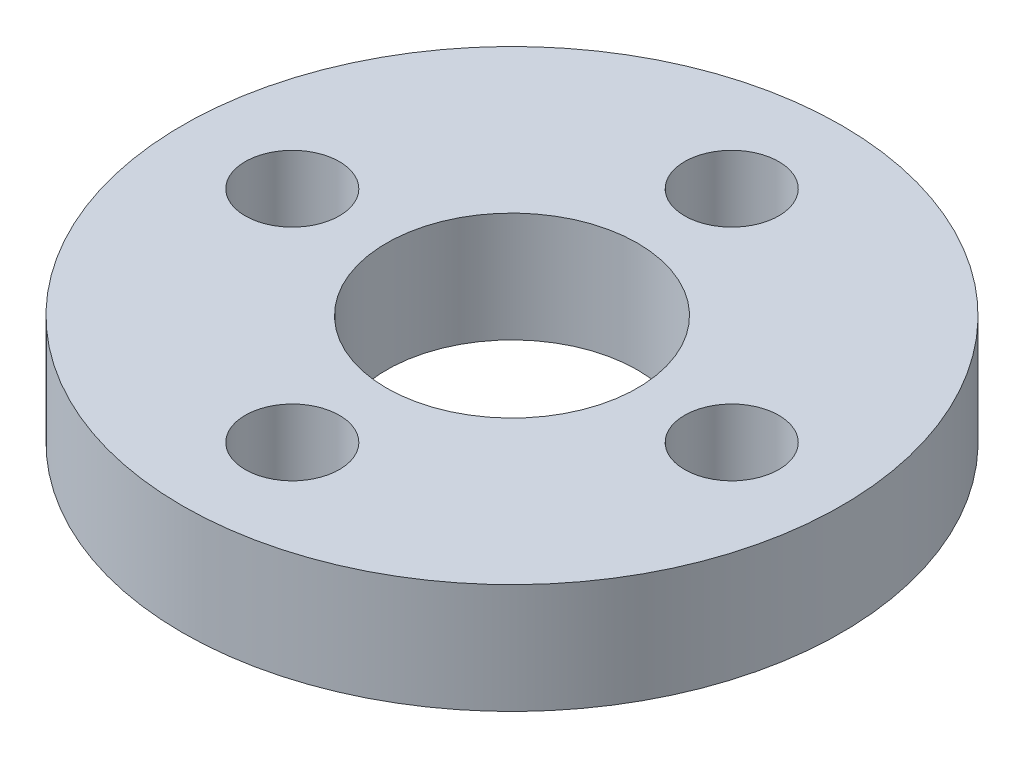
ISO-10303-21;
HEADER;
FILE_DESCRIPTION(('STEP AP214'),'2;1');
FILE_NAME('part.step','',(''),(''),'','','');
FILE_SCHEMA(('AUTOMOTIVE_DESIGN { 1 0 10303 214 1 1 1 1 }'));
ENDSEC;
DATA;
#1=APPLICATION_CONTEXT('core data for automotive mechanical design processes');
#2=APPLICATION_PROTOCOL_DEFINITION('international standard','automotive_design',2000,#1);
#3=PRODUCT_CONTEXT('',#1,'mechanical');
#4=PRODUCT('Part','Part','',(#3));
#5=PRODUCT_RELATED_PRODUCT_CATEGORY('part','',(#4));
#6=PRODUCT_DEFINITION_FORMATION('','',#4);
#7=PRODUCT_DEFINITION_CONTEXT('part definition',#1,'design');
#8=PRODUCT_DEFINITION('design','',#6,#7);
#9=PRODUCT_DEFINITION_SHAPE('','',#8);
#10=(LENGTH_UNIT() NAMED_UNIT(*) SI_UNIT(.MILLI.,.METRE.));
#11=(NAMED_UNIT(*) PLANE_ANGLE_UNIT() SI_UNIT($,.RADIAN.));
#12=(NAMED_UNIT(*) SI_UNIT($,.STERADIAN.) SOLID_ANGLE_UNIT());
#13=UNCERTAINTY_MEASURE_WITH_UNIT(LENGTH_MEASURE(1.E-05),#10,'distance_accuracy_value','');
#14=(GEOMETRIC_REPRESENTATION_CONTEXT(3) GLOBAL_UNCERTAINTY_ASSIGNED_CONTEXT((#13)) GLOBAL_UNIT_ASSIGNED_CONTEXT((#10,
#11,#12)) REPRESENTATION_CONTEXT('',''));
#15=CARTESIAN_POINT('',(0.,0.,0.));
#16=DIRECTION('',(0.,0.,1.));
#17=DIRECTION('',(1.,0.,0.));
#18=AXIS2_PLACEMENT_3D('',#15,#16,#17);
#19=CARTESIAN_POINT('',(0.,3.5,0.));
#20=DIRECTION('',(0.,-1.,0.));
#21=DIRECTION('',(0.,0.,-1.));
#22=AXIS2_PLACEMENT_3D('',#19,#20,#21);
#23=CYLINDRICAL_SURFACE('',#22,10.5);
#24=CARTESIAN_POINT('',(0.,3.5,0.));
#25=DIRECTION('',(0.,1.,0.));
#26=DIRECTION('',(0.,0.,1.));
#27=AXIS2_PLACEMENT_3D('',#24,#25,#26);
#28=CIRCLE('',#27,10.5);
#29=CARTESIAN_POINT('',(0.,3.5,-10.5));
#30=VERTEX_POINT('',#29);
#31=EDGE_CURVE('E10',#30,#30,#28,.T.);
#32=CARTESIAN_POINT('',(0.,0.,0.));
#33=DIRECTION('',(0.,1.,0.));
#34=DIRECTION('',(0.,0.,1.));
#35=AXIS2_PLACEMENT_3D('',#32,#33,#34);
#36=CIRCLE('',#35,10.5);
#37=CARTESIAN_POINT('',(0.,0.,-10.5));
#38=VERTEX_POINT('',#37);
#39=EDGE_CURVE('E39',#38,#38,#36,.T.);
#40=CARTESIAN_POINT('',(0.,3.5,-10.5));
#41=CARTESIAN_POINT('',(0.,3.46354166666667,-10.5));
#42=CARTESIAN_POINT('',(0.,3.42708333333333,-10.5));
#43=CARTESIAN_POINT('',(0.,3.35416666666667,-10.5));
#44=CARTESIAN_POINT('',(0.,3.31770833333333,-10.5));
#45=CARTESIAN_POINT('',(0.,3.24479166666667,-10.5));
#46=CARTESIAN_POINT('',(0.,3.20833333333333,-10.5));
#47=CARTESIAN_POINT('',(0.,3.13541666666667,-10.5));
#48=CARTESIAN_POINT('',(0.,3.09895833333333,-10.5));
#49=CARTESIAN_POINT('',(0.,3.02604166666667,-10.5));
#50=CARTESIAN_POINT('',(0.,2.98958333333333,-10.5));
#51=CARTESIAN_POINT('',(0.,2.91666666666667,-10.5));
#52=CARTESIAN_POINT('',(0.,2.88020833333333,-10.5));
#53=CARTESIAN_POINT('',(0.,2.80729166666667,-10.5));
#54=CARTESIAN_POINT('',(0.,2.77083333333333,-10.5));
#55=CARTESIAN_POINT('',(0.,2.69791666666667,-10.5));
#56=CARTESIAN_POINT('',(0.,2.66145833333333,-10.5));
#57=CARTESIAN_POINT('',(0.,2.58854166666667,-10.5));
#58=CARTESIAN_POINT('',(0.,2.55208333333333,-10.5));
#59=CARTESIAN_POINT('',(0.,2.47916666666667,-10.5));
#60=CARTESIAN_POINT('',(0.,2.44270833333333,-10.5));
#61=CARTESIAN_POINT('',(0.,2.36979166666667,-10.5));
#62=CARTESIAN_POINT('',(0.,2.33333333333333,-10.5));
#63=CARTESIAN_POINT('',(0.,2.26041666666667,-10.5));
#64=CARTESIAN_POINT('',(0.,2.22395833333333,-10.5));
#65=CARTESIAN_POINT('',(0.,2.15104166666667,-10.5));
#66=CARTESIAN_POINT('',(0.,2.11458333333333,-10.5));
#67=CARTESIAN_POINT('',(0.,2.04166666666667,-10.5));
#68=CARTESIAN_POINT('',(0.,2.00520833333333,-10.5));
#69=CARTESIAN_POINT('',(0.,1.93229166666667,-10.5));
#70=CARTESIAN_POINT('',(0.,1.89583333333333,-10.5));
#71=CARTESIAN_POINT('',(0.,1.82291666666667,-10.5));
#72=CARTESIAN_POINT('',(0.,1.78645833333333,-10.5));
#73=CARTESIAN_POINT('',(0.,1.71354166666667,-10.5));
#74=CARTESIAN_POINT('',(0.,1.67708333333333,-10.5));
#75=CARTESIAN_POINT('',(0.,1.60416666666667,-10.5));
#76=CARTESIAN_POINT('',(0.,1.56770833333333,-10.5));
#77=CARTESIAN_POINT('',(0.,1.49479166666667,-10.5));
#78=CARTESIAN_POINT('',(0.,1.45833333333333,-10.5));
#79=CARTESIAN_POINT('',(0.,1.38541666666667,-10.5));
#80=CARTESIAN_POINT('',(0.,1.34895833333333,-10.5));
#81=CARTESIAN_POINT('',(0.,1.27604166666667,-10.5));
#82=CARTESIAN_POINT('',(0.,1.23958333333333,-10.5));
#83=CARTESIAN_POINT('',(0.,1.16666666666667,-10.5));
#84=CARTESIAN_POINT('',(0.,1.13020833333333,-10.5));
#85=CARTESIAN_POINT('',(0.,1.05729166666667,-10.5));
#86=CARTESIAN_POINT('',(0.,1.02083333333333,-10.5));
#87=CARTESIAN_POINT('',(0.,0.947916666666666,-10.5));
#88=CARTESIAN_POINT('',(0.,0.911458333333333,-10.5));
#89=CARTESIAN_POINT('',(0.,0.838541666666666,-10.5));
#90=CARTESIAN_POINT('',(0.,0.802083333333333,-10.5));
#91=CARTESIAN_POINT('',(0.,0.729166666666667,-10.5));
#92=CARTESIAN_POINT('',(0.,0.692708333333333,-10.5));
#93=CARTESIAN_POINT('',(0.,0.619791666666666,-10.5));
#94=CARTESIAN_POINT('',(0.,0.583333333333333,-10.5));
#95=CARTESIAN_POINT('',(0.,0.510416666666666,-10.5));
#96=CARTESIAN_POINT('',(0.,0.473958333333333,-10.5));
#97=CARTESIAN_POINT('',(0.,0.401041666666666,-10.5));
#98=CARTESIAN_POINT('',(0.,0.364583333333333,-10.5));
#99=CARTESIAN_POINT('',(0.,0.291666666666666,-10.5));
#100=CARTESIAN_POINT('',(0.,0.255208333333333,-10.5));
#101=CARTESIAN_POINT('',(0.,0.182291666666666,-10.5));
#102=CARTESIAN_POINT('',(0.,0.145833333333333,-10.5));
#103=CARTESIAN_POINT('',(0.,0.0729166666666663,-10.5));
#104=CARTESIAN_POINT('',(0.,0.0364583333333329,-10.5));
#105=CARTESIAN_POINT('',(0.,0.,-10.5));
#106=B_SPLINE_CURVE_WITH_KNOTS('',3,(#40,#41,#42,#43,#44,#45,#46,#47,#48,#49,#50,#51,#52,#53,
#54,#55,#56,#57,#58,#59,#60,#61,#62,#63,#64,#65,#66,#67,#68,#69,#70,#71,#72,#73,#74,#75,#76,#77,
#78,#79,#80,#81,#82,#83,#84,#85,#86,#87,#88,#89,#90,#91,#92,#93,#94,#95,#96,#97,#98,#99,#100,
#101,#102,#103,#104,#105),.UNSPECIFIED.,.F.,.F.,(4,2,2,2,2,2,2,2,2,2,2,2,2,2,2,2,2,2,2,2,2,2,2,
2,2,2,2,2,2,2,2,2,4),(0.,0.109375,0.21875,0.328125,0.4375,0.546875,0.65625,0.765625,0.875,
0.984375,1.09375,1.203125,1.3125,1.421875,1.53125,1.640625,1.75,1.859375,1.96875,2.078125,
2.1875,2.296875,2.40625,2.515625,2.625,2.734375,2.84375,2.953125,3.0625,3.171875,3.28125,
3.390625,3.5),.UNSPECIFIED.);
#107=EDGE_CURVE('BSEAM32',#30,#38,#106,.T.);
#108=ORIENTED_EDGE('',*,*,#31,.F.);
#109=ORIENTED_EDGE('',*,*,#39,.T.);
#110=ORIENTED_EDGE('',*,*,#107,.T.);
#111=ORIENTED_EDGE('',*,*,#107,.F.);
#112=EDGE_LOOP('',(#108,#110,#109,#111));
#113=FACE_BOUND('',#112,.T.);
#114=ADVANCED_FACE('F32',(#113),#23,.T.);
#115=CARTESIAN_POINT('',(0.,3.5,0.));
#116=DIRECTION('',(0.,1.,0.));
#117=DIRECTION('',(0.,0.,1.));
#118=AXIS2_PLACEMENT_3D('',#115,#116,#117);
#119=PLANE('',#118);
#120=CARTESIAN_POINT('',(0.,3.5,-7.));
#121=DIRECTION('',(0.,1.,0.));
#122=DIRECTION('',(0.,0.,1.));
#123=AXIS2_PLACEMENT_3D('',#120,#121,#122);
#124=CIRCLE('',#123,1.5);
#125=CARTESIAN_POINT('',(0.,3.5,-5.5));
#126=VERTEX_POINT('',#125);
#127=EDGE_CURVE('E108',#126,#126,#124,.T.);
#128=ORIENTED_EDGE('',*,*,#127,.F.);
#129=EDGE_LOOP('',(#128));
#130=FACE_BOUND('',#129,.T.);
#131=CARTESIAN_POINT('',(7.0000000000002,3.5,-1.98094713253425E-13));
#132=DIRECTION('',(0.,1.,0.));
#133=DIRECTION('',(0.,0.,1.));
#134=AXIS2_PLACEMENT_3D('',#131,#132,#133);
#135=CIRCLE('',#134,1.50000000000015);
#136=CARTESIAN_POINT('',(7.0000000000002,3.5,1.49999999999996));
#137=VERTEX_POINT('',#136);
#138=EDGE_CURVE('E109',#137,#137,#135,.T.);
#139=ORIENTED_EDGE('',*,*,#138,.F.);
#140=EDGE_LOOP('',(#139));
#141=FACE_BOUND('',#140,.T.);
#142=CARTESIAN_POINT('',(3.9618942650685E-13,3.5,7.));
#143=DIRECTION('',(0.,1.,0.));
#144=DIRECTION('',(0.,0.,1.));
#145=AXIS2_PLACEMENT_3D('',#142,#143,#144);
#146=CIRCLE('',#145,1.50000000000043);
#147=CARTESIAN_POINT('',(3.9618942650685E-13,3.5,8.50000000000043));
#148=VERTEX_POINT('',#147);
#149=EDGE_CURVE('E113',#148,#148,#146,.T.);
#150=ORIENTED_EDGE('',*,*,#149,.F.);
#151=EDGE_LOOP('',(#150));
#152=FACE_BOUND('',#151,.T.);
#153=CARTESIAN_POINT('',(-6.9999999999998,3.5,1.98951966012828E-13));
#154=DIRECTION('',(0.,1.,0.));
#155=DIRECTION('',(0.,0.,1.));
#156=AXIS2_PLACEMENT_3D('',#153,#154,#155);
#157=CIRCLE('',#156,1.50000000000032);
#158=CARTESIAN_POINT('',(-6.9999999999998,3.5,1.50000000000052));
#159=VERTEX_POINT('',#158);
#160=EDGE_CURVE('E115',#159,#159,#157,.T.);
#161=ORIENTED_EDGE('',*,*,#160,.F.);
#162=EDGE_LOOP('',(#161));
#163=FACE_BOUND('',#162,.T.);
#164=CARTESIAN_POINT('',(0.,3.5,0.));
#165=DIRECTION('',(0.,1.,0.));
#166=DIRECTION('',(0.,0.,1.));
#167=AXIS2_PLACEMENT_3D('',#164,#165,#166);
#168=CIRCLE('',#167,4.);
#169=CARTESIAN_POINT('',(0.,3.5,4.));
#170=VERTEX_POINT('',#169);
#171=EDGE_CURVE('E46',#170,#170,#168,.T.);
#172=ORIENTED_EDGE('',*,*,#171,.F.);
#173=EDGE_LOOP('',(#172));
#174=FACE_BOUND('',#173,.T.);
#175=ORIENTED_EDGE('',*,*,#31,.T.);
#176=EDGE_LOOP('',(#175));
#177=FACE_BOUND('',#176,.T.);
#178=ADVANCED_FACE('F80',(#130,#141,#152,#163,#174,#177),#119,.T.);
#179=CARTESIAN_POINT('',(0.,0.,0.));
#180=DIRECTION('',(0.,1.,0.));
#181=DIRECTION('',(0.,0.,1.));
#182=AXIS2_PLACEMENT_3D('',#179,#180,#181);
#183=PLANE('',#182);
#184=CARTESIAN_POINT('',(0.,0.,-7.));
#185=DIRECTION('',(0.,1.,0.));
#186=DIRECTION('',(0.,0.,1.));
#187=AXIS2_PLACEMENT_3D('',#184,#185,#186);
#188=CIRCLE('',#187,1.5);
#189=CARTESIAN_POINT('',(0.,0.,-5.5));
#190=VERTEX_POINT('',#189);
#191=EDGE_CURVE('E35',#190,#190,#188,.T.);
#192=ORIENTED_EDGE('',*,*,#191,.T.);
#193=EDGE_LOOP('',(#192));
#194=FACE_BOUND('',#193,.T.);
#195=CARTESIAN_POINT('',(7.0000000000002,0.,-1.98094713253425E-13));
#196=DIRECTION('',(0.,1.,0.));
#197=DIRECTION('',(0.,0.,1.));
#198=AXIS2_PLACEMENT_3D('',#195,#196,#197);
#199=CIRCLE('',#198,1.50000000000015);
#200=CARTESIAN_POINT('',(7.0000000000002,0.,1.49999999999996));
#201=VERTEX_POINT('',#200);
#202=EDGE_CURVE('E57',#201,#201,#199,.T.);
#203=ORIENTED_EDGE('',*,*,#202,.T.);
#204=EDGE_LOOP('',(#203));
#205=FACE_BOUND('',#204,.T.);
#206=CARTESIAN_POINT('',(3.9618942650685E-13,0.,7.));
#207=DIRECTION('',(0.,1.,0.));
#208=DIRECTION('',(0.,0.,1.));
#209=AXIS2_PLACEMENT_3D('',#206,#207,#208);
#210=CIRCLE('',#209,1.50000000000043);
#211=CARTESIAN_POINT('',(3.9618942650685E-13,0.,8.50000000000043));
#212=VERTEX_POINT('',#211);
#213=EDGE_CURVE('E55',#212,#212,#210,.T.);
#214=ORIENTED_EDGE('',*,*,#213,.T.);
#215=EDGE_LOOP('',(#214));
#216=FACE_BOUND('',#215,.T.);
#217=CARTESIAN_POINT('',(-6.9999999999998,0.,1.98951966012828E-13));
#218=DIRECTION('',(0.,1.,0.));
#219=DIRECTION('',(0.,0.,1.));
#220=AXIS2_PLACEMENT_3D('',#217,#218,#219);
#221=CIRCLE('',#220,1.50000000000032);
#222=CARTESIAN_POINT('',(-6.9999999999998,0.,1.50000000000052));
#223=VERTEX_POINT('',#222);
#224=EDGE_CURVE('E52',#223,#223,#221,.T.);
#225=ORIENTED_EDGE('',*,*,#224,.T.);
#226=EDGE_LOOP('',(#225));
#227=FACE_BOUND('',#226,.T.);
#228=CARTESIAN_POINT('',(0.,0.,0.));
#229=DIRECTION('',(0.,1.,0.));
#230=DIRECTION('',(0.,0.,1.));
#231=AXIS2_PLACEMENT_3D('',#228,#229,#230);
#232=CIRCLE('',#231,4.);
#233=CARTESIAN_POINT('',(0.,0.,4.));
#234=VERTEX_POINT('',#233);
#235=EDGE_CURVE('E49',#234,#234,#232,.T.);
#236=ORIENTED_EDGE('',*,*,#235,.T.);
#237=EDGE_LOOP('',(#236));
#238=FACE_BOUND('',#237,.T.);
#239=ORIENTED_EDGE('',*,*,#39,.F.);
#240=EDGE_LOOP('',(#239));
#241=FACE_BOUND('',#240,.T.);
#242=ADVANCED_FACE('F64',(#194,#205,#216,#227,#238,#241),#183,.F.);
#243=CARTESIAN_POINT('',(0.,-6.7,0.));
#244=DIRECTION('',(0.,1.,0.));
#245=DIRECTION('',(0.,0.,1.));
#246=AXIS2_PLACEMENT_3D('',#243,#244,#245);
#247=CYLINDRICAL_SURFACE('',#246,4.);
#248=ORIENTED_EDGE('',*,*,#171,.T.);
#249=EDGE_LOOP('',(#248));
#250=FACE_BOUND('',#249,.T.);
#251=ORIENTED_EDGE('',*,*,#235,.F.);
#252=EDGE_LOOP('',(#251));
#253=FACE_BOUND('',#252,.T.);
#254=ADVANCED_FACE('F91',(#250,#253),#247,.F.);
#255=CARTESIAN_POINT('',(-6.9999999999998,-6.7,1.98951966012828E-13));
#256=DIRECTION('',(0.,1.,0.));
#257=DIRECTION('',(0.,0.,1.));
#258=AXIS2_PLACEMENT_3D('',#255,#256,#257);
#259=CYLINDRICAL_SURFACE('',#258,1.50000000000032);
#260=ORIENTED_EDGE('',*,*,#160,.T.);
#261=EDGE_LOOP('',(#260));
#262=FACE_BOUND('',#261,.T.);
#263=ORIENTED_EDGE('',*,*,#224,.F.);
#264=EDGE_LOOP('',(#263));
#265=FACE_BOUND('',#264,.T.);
#266=ADVANCED_FACE('F95',(#262,#265),#259,.F.);
#267=CARTESIAN_POINT('',(3.9618942650685E-13,-6.7,7.));
#268=DIRECTION('',(0.,1.,0.));
#269=DIRECTION('',(0.,0.,1.));
#270=AXIS2_PLACEMENT_3D('',#267,#268,#269);
#271=CYLINDRICAL_SURFACE('',#270,1.50000000000043);
#272=ORIENTED_EDGE('',*,*,#149,.T.);
#273=EDGE_LOOP('',(#272));
#274=FACE_BOUND('',#273,.T.);
#275=ORIENTED_EDGE('',*,*,#213,.F.);
#276=EDGE_LOOP('',(#275));
#277=FACE_BOUND('',#276,.T.);
#278=ADVANCED_FACE('F74',(#274,#277),#271,.F.);
#279=CARTESIAN_POINT('',(7.0000000000002,-6.7,-1.98094713253425E-13));
#280=DIRECTION('',(0.,1.,0.));
#281=DIRECTION('',(0.,0.,1.));
#282=AXIS2_PLACEMENT_3D('',#279,#280,#281);
#283=CYLINDRICAL_SURFACE('',#282,1.50000000000015);
#284=ORIENTED_EDGE('',*,*,#138,.T.);
#285=EDGE_LOOP('',(#284));
#286=FACE_BOUND('',#285,.T.);
#287=ORIENTED_EDGE('',*,*,#202,.F.);
#288=EDGE_LOOP('',(#287));
#289=FACE_BOUND('',#288,.T.);
#290=ADVANCED_FACE('F68',(#286,#289),#283,.F.);
#291=CARTESIAN_POINT('',(0.,-6.7,-7.));
#292=DIRECTION('',(0.,1.,0.));
#293=DIRECTION('',(0.,0.,1.));
#294=AXIS2_PLACEMENT_3D('',#291,#292,#293);
#295=CYLINDRICAL_SURFACE('',#294,1.5);
#296=ORIENTED_EDGE('',*,*,#127,.T.);
#297=EDGE_LOOP('',(#296));
#298=FACE_BOUND('',#297,.T.);
#299=ORIENTED_EDGE('',*,*,#191,.F.);
#300=EDGE_LOOP('',(#299));
#301=FACE_BOUND('',#300,.T.);
#302=ADVANCED_FACE('F66',(#298,#301),#295,.F.);
#303=CLOSED_SHELL('',(#114,#178,#242,#254,#266,#278,#290,#302));
#304=MANIFOLD_SOLID_BREP('B2',#303);
#305=ADVANCED_BREP_SHAPE_REPRESENTATION('',(#18,#304),#14);
#306=SHAPE_DEFINITION_REPRESENTATION(#9,#305);
ENDSEC;
END-ISO-10303-21;
